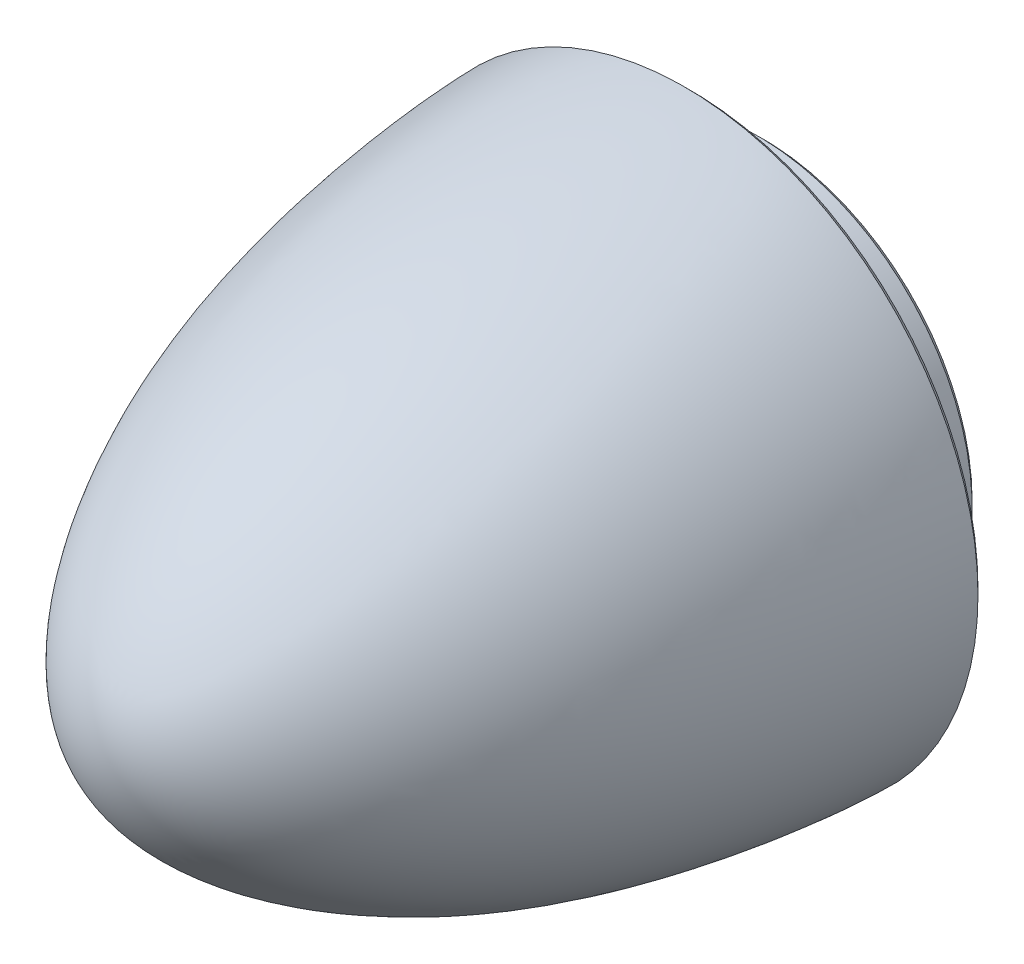
ISO-10303-21;
HEADER;
FILE_DESCRIPTION(('STEP AP214'),'2;1');
FILE_NAME('part.step','',(''),(''),'','','');
FILE_SCHEMA(('AUTOMOTIVE_DESIGN { 1 0 10303 214 1 1 1 1 }'));
ENDSEC;
DATA;
#1=APPLICATION_CONTEXT('core data for automotive mechanical design processes');
#2=APPLICATION_PROTOCOL_DEFINITION('international standard','automotive_design',2000,#1);
#3=PRODUCT_CONTEXT('',#1,'mechanical');
#4=PRODUCT('Part','Part','',(#3));
#5=PRODUCT_RELATED_PRODUCT_CATEGORY('part','',(#4));
#6=PRODUCT_DEFINITION_FORMATION('','',#4);
#7=PRODUCT_DEFINITION_CONTEXT('part definition',#1,'design');
#8=PRODUCT_DEFINITION('design','',#6,#7);
#9=PRODUCT_DEFINITION_SHAPE('','',#8);
#10=(LENGTH_UNIT() NAMED_UNIT(*) SI_UNIT(.MILLI.,.METRE.));
#11=(NAMED_UNIT(*) PLANE_ANGLE_UNIT() SI_UNIT($,.RADIAN.));
#12=(NAMED_UNIT(*) SI_UNIT($,.STERADIAN.) SOLID_ANGLE_UNIT());
#13=UNCERTAINTY_MEASURE_WITH_UNIT(LENGTH_MEASURE(1.E-05),#10,'distance_accuracy_value','');
#14=(GEOMETRIC_REPRESENTATION_CONTEXT(3) GLOBAL_UNCERTAINTY_ASSIGNED_CONTEXT((#13)) GLOBAL_UNIT_ASSIGNED_CONTEXT((#10,
#11,#12)) REPRESENTATION_CONTEXT('',''));
#15=CARTESIAN_POINT('',(0.,0.,0.));
#16=DIRECTION('',(0.,0.,1.));
#17=DIRECTION('',(1.,0.,0.));
#18=AXIS2_PLACEMENT_3D('',#15,#16,#17);
#19=CARTESIAN_POINT('',(0.,0.,0.100515376267957));
#20=CARTESIAN_POINT('',(4.25178751235128,0.,0.100728380571197));
#21=CARTESIAN_POINT('',(11.607750415029,0.,-9.98122743259241));
#22=CARTESIAN_POINT('',(12.7,0.,-23.1921558475372));
#23=CARTESIAN_POINT('',(12.7,0.,-25.299484623732));
#24=B_SPLINE_CURVE_WITH_KNOTS('',3,(#19,#20,#21,#22,#23),.UNSPECIFIED.,.F.,.F.,(4,1,4),
(0.499999999999142,0.789002783765536,1.),.UNSPECIFIED.);
#25=CARTESIAN_POINT('',(0.,0.,0.100515376267957));
#26=DIRECTION('',(0.,0.,1.));
#27=AXIS1_PLACEMENT('',#25,#26);
#28=SURFACE_OF_REVOLUTION('',#24,#27);
#29=CARTESIAN_POINT('',(0.,0.,-25.0474715086582));
#30=DIRECTION('',(0.,0.,1.));
#31=DIRECTION('',(1.,0.,0.));
#32=AXIS2_PLACEMENT_3D('',#29,#30,#31);
#33=CIRCLE('',#32,12.6980131150738);
#34=CARTESIAN_POINT('',(12.6980131150738,0.,-25.0474715086582));
#35=VERTEX_POINT('',#34);
#36=EDGE_CURVE('E52',#35,#35,#33,.T.);
#37=ORIENTED_EDGE('',*,*,#36,.T.);
#38=EDGE_LOOP('',(#37));
#39=FACE_BOUND('',#38,.T.);
#40=CARTESIAN_POINT('',(0.,0.,0.100515376267957));
#41=VERTEX_POINT('',#40);
#42=VERTEX_LOOP('',#41);
#43=FACE_BOUND('',#42,.T.);
#44=ADVANCED_FACE('F44',(#39,#43),#28,.F.);
#45=CARTESIAN_POINT('',(0.,0.,-25.299484623732));
#46=DIRECTION('',(0.,0.,-1.));
#47=DIRECTION('',(-1.,0.,0.));
#48=AXIS2_PLACEMENT_3D('',#45,#46,#47);
#49=PLANE('',#48);
#50=CARTESIAN_POINT('',(0.,0.,-25.299484623732));
#51=DIRECTION('',(0.,0.,-1.));
#52=DIRECTION('',(-1.,0.,0.));
#53=AXIS2_PLACEMENT_3D('',#50,#51,#52);
#54=CIRCLE('',#53,12.446);
#55=CARTESIAN_POINT('',(-12.446,0.,-25.299484623732));
#56=VERTEX_POINT('',#55);
#57=EDGE_CURVE('E11',#56,#56,#54,.T.);
#58=ORIENTED_EDGE('',*,*,#57,.T.);
#59=EDGE_LOOP('',(#58));
#60=FACE_BOUND('',#59,.T.);
#61=CARTESIAN_POINT('',(0.,0.,-25.299484623732));
#62=DIRECTION('',(0.,0.,-1.));
#63=DIRECTION('',(-1.,0.,0.));
#64=AXIS2_PLACEMENT_3D('',#61,#62,#63);
#65=CIRCLE('',#64,9.525);
#66=CARTESIAN_POINT('',(-9.525,0.,-25.299484623732));
#67=VERTEX_POINT('',#66);
#68=EDGE_CURVE('E80',#67,#67,#65,.F.);
#69=ORIENTED_EDGE('',*,*,#68,.T.);
#70=EDGE_LOOP('',(#69));
#71=FACE_BOUND('',#70,.T.);
#72=ADVANCED_FACE('F56',(#60,#71),#49,.T.);
#73=CARTESIAN_POINT('',(0.,0.,-28.474484623732));
#74=DIRECTION('',(0.,0.,1.));
#75=DIRECTION('',(1.,0.,0.));
#76=AXIS2_PLACEMENT_3D('',#73,#74,#75);
#77=CYLINDRICAL_SURFACE('',#76,9.271);
#78=CARTESIAN_POINT('',(0.,0.,-28.220484623732));
#79=DIRECTION('',(0.,0.,-1.));
#80=DIRECTION('',(-1.,0.,0.));
#81=AXIS2_PLACEMENT_3D('',#78,#79,#80);
#82=CIRCLE('',#81,9.271);
#83=CARTESIAN_POINT('',(-9.271,0.,-28.220484623732));
#84=VERTEX_POINT('',#83);
#85=EDGE_CURVE('E86',#84,#84,#82,.F.);
#86=ORIENTED_EDGE('',*,*,#85,.T.);
#87=EDGE_LOOP('',(#86));
#88=FACE_BOUND('',#87,.T.);
#89=CARTESIAN_POINT('',(0.,0.,-25.553484623732));
#90=DIRECTION('',(0.,0.,-1.));
#91=DIRECTION('',(-1.,0.,0.));
#92=AXIS2_PLACEMENT_3D('',#89,#90,#91);
#93=CIRCLE('',#92,9.271);
#94=CARTESIAN_POINT('',(-9.271,0.,-25.553484623732));
#95=VERTEX_POINT('',#94);
#96=EDGE_CURVE('E74',#95,#95,#93,.T.);
#97=ORIENTED_EDGE('',*,*,#96,.T.);
#98=EDGE_LOOP('',(#97));
#99=FACE_BOUND('',#98,.T.);
#100=ADVANCED_FACE('F62',(#88,#99),#77,.T.);
#101=CARTESIAN_POINT('',(0.,0.,-28.474484623732));
#102=DIRECTION('',(0.,0.,-1.));
#103=DIRECTION('',(-1.,0.,0.));
#104=AXIS2_PLACEMENT_3D('',#101,#102,#103);
#105=PLANE('',#104);
#106=CARTESIAN_POINT('',(0.,0.,-28.474484623732));
#107=DIRECTION('',(0.,0.,-1.));
#108=DIRECTION('',(-1.,0.,0.));
#109=AXIS2_PLACEMENT_3D('',#106,#107,#108);
#110=CIRCLE('',#109,9.017);
#111=CARTESIAN_POINT('',(-9.017,0.,-28.474484623732));
#112=VERTEX_POINT('',#111);
#113=EDGE_CURVE('E83',#112,#112,#110,.T.);
#114=ORIENTED_EDGE('',*,*,#113,.T.);
#115=EDGE_LOOP('',(#114));
#116=FACE_BOUND('',#115,.T.);
#117=ADVANCED_FACE('F103',(#116),#105,.T.);
#118=CARTESIAN_POINT('',(0.,0.,-25.553484623732));
#119=DIRECTION('',(0.,0.,-1.));
#120=DIRECTION('',(-1.,0.,0.));
#121=AXIS2_PLACEMENT_3D('',#118,#119,#120);
#122=TOROIDAL_SURFACE('',#121,9.525,0.254);
#123=ORIENTED_EDGE('',*,*,#68,.F.);
#124=EDGE_LOOP('',(#123));
#125=FACE_BOUND('',#124,.T.);
#126=ORIENTED_EDGE('',*,*,#96,.F.);
#127=EDGE_LOOP('',(#126));
#128=FACE_BOUND('',#127,.T.);
#129=ADVANCED_FACE('F69',(#125,#128),#122,.F.);
#130=CARTESIAN_POINT('',(0.,0.,-28.474484623732));
#131=DIRECTION('',(0.,0.,1.));
#132=DIRECTION('',(1.,0.,0.));
#133=AXIS2_PLACEMENT_3D('',#130,#131,#132);
#134=CONICAL_SURFACE('',#133,9.017,0.785398163397458);
#135=ORIENTED_EDGE('',*,*,#85,.F.);
#136=EDGE_LOOP('',(#135));
#137=FACE_BOUND('',#136,.T.);
#138=ORIENTED_EDGE('',*,*,#113,.F.);
#139=EDGE_LOOP('',(#138));
#140=FACE_BOUND('',#139,.T.);
#141=ADVANCED_FACE('F91',(#137,#140),#134,.T.);
#142=CARTESIAN_POINT('',(0.,0.,-25.0474715086582));
#143=DIRECTION('',(0.,0.,1.));
#144=DIRECTION('',(1.,0.,0.));
#145=AXIS2_PLACEMENT_3D('',#142,#143,#144);
#146=CONICAL_SURFACE('',#145,12.6980131150738,0.785398163397462);
#147=ORIENTED_EDGE('',*,*,#57,.F.);
#148=EDGE_LOOP('',(#147));
#149=FACE_BOUND('',#148,.T.);
#150=ORIENTED_EDGE('',*,*,#36,.F.);
#151=EDGE_LOOP('',(#150));
#152=FACE_BOUND('',#151,.T.);
#153=ADVANCED_FACE('F47',(#149,#152),#146,.T.);
#154=CLOSED_SHELL('',(#44,#72,#100,#117,#129,#141,#153));
#155=MANIFOLD_SOLID_BREP('B2',#154);
#156=ADVANCED_BREP_SHAPE_REPRESENTATION('',(#18,#155),#14);
#157=SHAPE_DEFINITION_REPRESENTATION(#9,#156);
ENDSEC;
END-ISO-10303-21;
